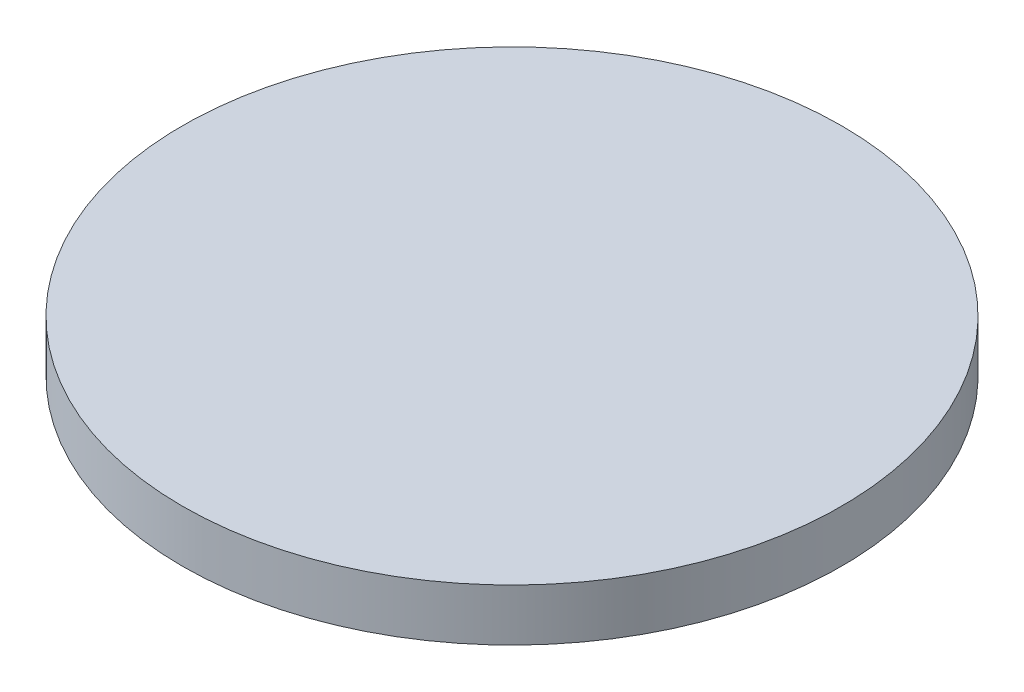
ISO-10303-21;
HEADER;
FILE_DESCRIPTION(('STEP AP214'),'2;1');
FILE_NAME('part.step','',(''),(''),'','','');
FILE_SCHEMA(('AUTOMOTIVE_DESIGN { 1 0 10303 214 1 1 1 1 }'));
ENDSEC;
DATA;
#1=APPLICATION_CONTEXT('core data for automotive mechanical design processes');
#2=APPLICATION_PROTOCOL_DEFINITION('international standard','automotive_design',2000,#1);
#3=PRODUCT_CONTEXT('',#1,'mechanical');
#4=PRODUCT('Part','Part','',(#3));
#5=PRODUCT_RELATED_PRODUCT_CATEGORY('part','',(#4));
#6=PRODUCT_DEFINITION_FORMATION('','',#4);
#7=PRODUCT_DEFINITION_CONTEXT('part definition',#1,'design');
#8=PRODUCT_DEFINITION('design','',#6,#7);
#9=PRODUCT_DEFINITION_SHAPE('','',#8);
#10=(LENGTH_UNIT() NAMED_UNIT(*) SI_UNIT(.MILLI.,.METRE.));
#11=(NAMED_UNIT(*) PLANE_ANGLE_UNIT() SI_UNIT($,.RADIAN.));
#12=(NAMED_UNIT(*) SI_UNIT($,.STERADIAN.) SOLID_ANGLE_UNIT());
#13=UNCERTAINTY_MEASURE_WITH_UNIT(LENGTH_MEASURE(1.E-05),#10,'distance_accuracy_value','');
#14=(GEOMETRIC_REPRESENTATION_CONTEXT(3) GLOBAL_UNCERTAINTY_ASSIGNED_CONTEXT((#13)) GLOBAL_UNIT_ASSIGNED_CONTEXT((#10,
#11,#12)) REPRESENTATION_CONTEXT('',''));
#15=CARTESIAN_POINT('',(0.,0.,0.));
#16=DIRECTION('',(0.,0.,1.));
#17=DIRECTION('',(1.,0.,0.));
#18=AXIS2_PLACEMENT_3D('',#15,#16,#17);
#19=CARTESIAN_POINT('',(0.,3.,0.));
#20=DIRECTION('',(0.,-1.,0.));
#21=DIRECTION('',(0.,0.,-1.));
#22=AXIS2_PLACEMENT_3D('',#19,#20,#21);
#23=CYLINDRICAL_SURFACE('',#22,19.);
#24=CARTESIAN_POINT('',(0.,3.,0.));
#25=DIRECTION('',(0.,1.,0.));
#26=DIRECTION('',(0.,0.,1.));
#27=AXIS2_PLACEMENT_3D('',#24,#25,#26);
#28=CIRCLE('',#27,19.);
#29=CARTESIAN_POINT('',(0.,3.,19.));
#30=VERTEX_POINT('',#29);
#31=EDGE_CURVE('E10',#30,#30,#28,.T.);
#32=ORIENTED_EDGE('',*,*,#31,.F.);
#33=EDGE_LOOP('',(#32));
#34=FACE_BOUND('',#33,.T.);
#35=CARTESIAN_POINT('',(0.,0.,0.));
#36=DIRECTION('',(0.,1.,0.));
#37=DIRECTION('',(0.,0.,1.));
#38=AXIS2_PLACEMENT_3D('',#35,#36,#37);
#39=CIRCLE('',#38,19.);
#40=CARTESIAN_POINT('',(0.,0.,19.));
#41=VERTEX_POINT('',#40);
#42=EDGE_CURVE('E38',#41,#41,#39,.T.);
#43=ORIENTED_EDGE('',*,*,#42,.T.);
#44=EDGE_LOOP('',(#43));
#45=FACE_BOUND('',#44,.T.);
#46=ADVANCED_FACE('F35',(#34,#45),#23,.T.);
#47=CARTESIAN_POINT('',(0.,3.,0.));
#48=DIRECTION('',(0.,1.,0.));
#49=DIRECTION('',(0.,0.,1.));
#50=AXIS2_PLACEMENT_3D('',#47,#48,#49);
#51=PLANE('',#50);
#52=ORIENTED_EDGE('',*,*,#31,.T.);
#53=EDGE_LOOP('',(#52));
#54=FACE_BOUND('',#53,.T.);
#55=ADVANCED_FACE('F50',(#54),#51,.T.);
#56=CARTESIAN_POINT('',(0.,0.,0.));
#57=DIRECTION('',(0.,1.,0.));
#58=DIRECTION('',(0.,0.,1.));
#59=AXIS2_PLACEMENT_3D('',#56,#57,#58);
#60=PLANE('',#59);
#61=ORIENTED_EDGE('',*,*,#42,.F.);
#62=EDGE_LOOP('',(#61));
#63=FACE_BOUND('',#62,.T.);
#64=ADVANCED_FACE('F48',(#63),#60,.F.);
#65=CLOSED_SHELL('',(#46,#55,#64));
#66=MANIFOLD_SOLID_BREP('B2',#65);
#67=ADVANCED_BREP_SHAPE_REPRESENTATION('',(#18,#66),#14);
#68=SHAPE_DEFINITION_REPRESENTATION(#9,#67);
ENDSEC;
END-ISO-10303-21;
